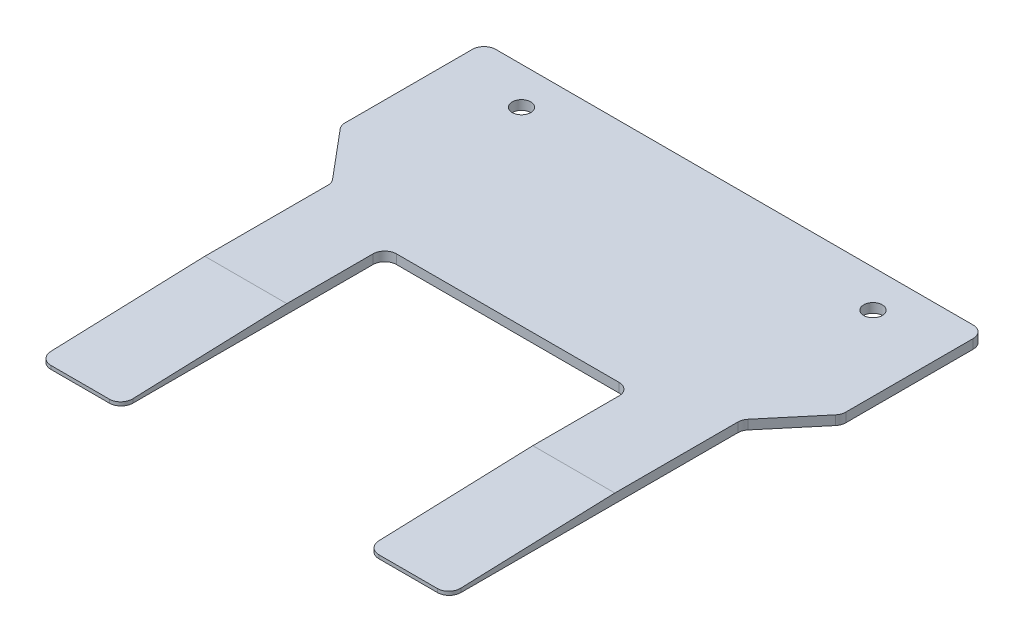
ISO-10303-21;
HEADER;
FILE_DESCRIPTION(('STEP AP214'),'2;1');
FILE_NAME('part.step','',(''),(''),'','','');
FILE_SCHEMA(('AUTOMOTIVE_DESIGN { 1 0 10303 214 1 1 1 1 }'));
ENDSEC;
DATA;
#1=APPLICATION_CONTEXT('core data for automotive mechanical design processes');
#2=APPLICATION_PROTOCOL_DEFINITION('international standard','automotive_design',2000,#1);
#3=PRODUCT_CONTEXT('',#1,'mechanical');
#4=PRODUCT('Part','Part','',(#3));
#5=PRODUCT_RELATED_PRODUCT_CATEGORY('part','',(#4));
#6=PRODUCT_DEFINITION_FORMATION('','',#4);
#7=PRODUCT_DEFINITION_CONTEXT('part definition',#1,'design');
#8=PRODUCT_DEFINITION('design','',#6,#7);
#9=PRODUCT_DEFINITION_SHAPE('','',#8);
#10=(LENGTH_UNIT() NAMED_UNIT(*) SI_UNIT(.MILLI.,.METRE.));
#11=(NAMED_UNIT(*) PLANE_ANGLE_UNIT() SI_UNIT($,.RADIAN.));
#12=(NAMED_UNIT(*) SI_UNIT($,.STERADIAN.) SOLID_ANGLE_UNIT());
#13=UNCERTAINTY_MEASURE_WITH_UNIT(LENGTH_MEASURE(1.E-05),#10,'distance_accuracy_value','');
#14=(GEOMETRIC_REPRESENTATION_CONTEXT(3) GLOBAL_UNCERTAINTY_ASSIGNED_CONTEXT((#13)) GLOBAL_UNIT_ASSIGNED_CONTEXT((#10,
#11,#12)) REPRESENTATION_CONTEXT('',''));
#15=CARTESIAN_POINT('',(0.,0.,0.));
#16=DIRECTION('',(0.,0.,1.));
#17=DIRECTION('',(1.,0.,0.));
#18=AXIS2_PLACEMENT_3D('',#15,#16,#17);
#19=CARTESIAN_POINT('',(-19.,1.5875,40.7));
#20=DIRECTION('',(0.,-1.,0.));
#21=DIRECTION('',(0.,0.,-1.));
#22=AXIS2_PLACEMENT_3D('',#19,#20,#21);
#23=PLANE('',#22);
#24=DIRECTION('',(0.,0.,1.));
#25=VECTOR('',#24,1.);
#26=CARTESIAN_POINT('',(-35.,1.5875,34.4279404685324));
#27=LINE('',#26,#25);
#28=CARTESIAN_POINT('',(-35.,1.5875,34.4279404685324));
#29=VERTEX_POINT('',#28);
#30=CARTESIAN_POINT('',(-35.,1.5875,55.4216998831214));
#31=VERTEX_POINT('',#30);
#32=EDGE_CURVE('E418',#29,#31,#27,.T.);
#33=ORIENTED_EDGE('',*,*,#32,.T.);
#34=DIRECTION('',(1.,0.,0.));
#35=VECTOR('',#34,1.);
#36=CARTESIAN_POINT('',(-42.75,1.5875,55.4216998831214));
#37=LINE('',#36,#35);
#38=CARTESIAN_POINT('',(-21.,1.5875,55.4216998831214));
#39=VERTEX_POINT('',#38);
#40=EDGE_CURVE('E424',#31,#39,#37,.T.);
#41=ORIENTED_EDGE('',*,*,#40,.T.);
#42=DIRECTION('',(0.,0.,-1.));
#43=VECTOR('',#42,1.);
#44=CARTESIAN_POINT('',(-21.,1.5875,81.7));
#45=LINE('',#44,#43);
#46=CARTESIAN_POINT('',(-21.,1.5875,40.7));
#47=VERTEX_POINT('',#46);
#48=EDGE_CURVE('E309',#39,#47,#45,.T.);
#49=ORIENTED_EDGE('',*,*,#48,.T.);
#50=CARTESIAN_POINT('',(-19.,1.5875,40.7));
#51=DIRECTION('',(0.,-1.,0.));
#52=DIRECTION('',(0.,0.,-1.));
#53=AXIS2_PLACEMENT_3D('',#50,#51,#52);
#54=CIRCLE('',#53,2.);
#55=CARTESIAN_POINT('',(-19.,1.5875,38.7));
#56=VERTEX_POINT('',#55);
#57=EDGE_CURVE('E360',#47,#56,#54,.T.);
#58=ORIENTED_EDGE('',*,*,#57,.T.);
#59=DIRECTION('',(1.,0.,0.));
#60=VECTOR('',#59,1.);
#61=CARTESIAN_POINT('',(-19.,1.5875,38.7));
#62=LINE('',#61,#60);
#63=CARTESIAN_POINT('',(19.,1.5875,38.7));
#64=VERTEX_POINT('',#63);
#65=EDGE_CURVE('E290',#56,#64,#62,.T.);
#66=ORIENTED_EDGE('',*,*,#65,.T.);
#67=CARTESIAN_POINT('',(19.,1.5875,40.7));
#68=DIRECTION('',(0.,-1.,0.));
#69=DIRECTION('',(0.,0.,-1.));
#70=AXIS2_PLACEMENT_3D('',#67,#68,#69);
#71=CIRCLE('',#70,2.);
#72=CARTESIAN_POINT('',(21.,1.5875,40.7));
#73=VERTEX_POINT('',#72);
#74=EDGE_CURVE('E390',#64,#73,#71,.T.);
#75=ORIENTED_EDGE('',*,*,#74,.T.);
#76=DIRECTION('',(0.,0.,1.));
#77=VECTOR('',#76,1.);
#78=CARTESIAN_POINT('',(21.,1.5875,40.7));
#79=LINE('',#78,#77);
#80=CARTESIAN_POINT('',(21.,1.5875,55.4216998831214));
#81=VERTEX_POINT('',#80);
#82=EDGE_CURVE('E392',#73,#81,#79,.T.);
#83=ORIENTED_EDGE('',*,*,#82,.T.);
#84=CARTESIAN_POINT('',(35.,1.5875,55.4216998831214));
#85=VERTEX_POINT('',#84);
#86=EDGE_CURVE('E220',#81,#85,#37,.T.);
#87=ORIENTED_EDGE('',*,*,#86,.T.);
#88=DIRECTION('',(0.,0.,-1.));
#89=VECTOR('',#88,1.);
#90=CARTESIAN_POINT('',(35.,1.5875,81.7));
#91=LINE('',#90,#89);
#92=CARTESIAN_POINT('',(35.,1.5875,34.4279404685324));
#93=VERTEX_POINT('',#92);
#94=EDGE_CURVE('E395',#85,#93,#91,.T.);
#95=ORIENTED_EDGE('',*,*,#94,.T.);
#96=CARTESIAN_POINT('',(37.,1.5875,34.4279404685324));
#97=DIRECTION('',(0.,-1.,0.));
#98=DIRECTION('',(0.,0.,1.));
#99=AXIS2_PLACEMENT_3D('',#96,#97,#98);
#100=CIRCLE('',#99,2.);
#101=CARTESIAN_POINT('',(35.4679111137621,1.5875,33.1423652491593));
#102=VERTEX_POINT('',#101);
#103=EDGE_CURVE('E397',#93,#102,#100,.T.);
#104=ORIENTED_EDGE('',*,*,#103,.T.);
#105=DIRECTION('',(0.64278760968654,0.,-0.766044443118977));
#106=VECTOR('',#105,1.);
#107=CARTESIAN_POINT('',(42.282088886238,1.5875,25.0215444082355));
#108=LINE('',#107,#106);
#109=CARTESIAN_POINT('',(42.282088886238,1.5875,25.0215444082355));
#110=VERTEX_POINT('',#109);
#111=EDGE_CURVE('E399',#102,#110,#108,.T.);
#112=ORIENTED_EDGE('',*,*,#111,.T.);
#113=CARTESIAN_POINT('',(40.75,1.5875,23.7359691888625));
#114=DIRECTION('',(0.,1.,0.));
#115=DIRECTION('',(0.,0.,-1.));
#116=AXIS2_PLACEMENT_3D('',#113,#114,#115);
#117=CIRCLE('',#116,2.);
#118=CARTESIAN_POINT('',(42.75,1.5875,23.7359691888625));
#119=VERTEX_POINT('',#118);
#120=EDGE_CURVE('E401',#110,#119,#117,.T.);
#121=ORIENTED_EDGE('',*,*,#120,.T.);
#122=DIRECTION('',(0.,0.,-1.));
#123=VECTOR('',#122,1.);
#124=CARTESIAN_POINT('',(42.75,1.5875,2.));
#125=LINE('',#124,#123);
#126=CARTESIAN_POINT('',(42.75,1.5875,2.));
#127=VERTEX_POINT('',#126);
#128=EDGE_CURVE('E403',#119,#127,#125,.T.);
#129=ORIENTED_EDGE('',*,*,#128,.T.);
#130=CARTESIAN_POINT('',(40.75,1.5875,2.));
#131=DIRECTION('',(0.,1.,0.));
#132=DIRECTION('',(0.,0.,-1.));
#133=AXIS2_PLACEMENT_3D('',#130,#131,#132);
#134=CIRCLE('',#133,2.);
#135=CARTESIAN_POINT('',(40.75,1.5875,0.));
#136=VERTEX_POINT('',#135);
#137=EDGE_CURVE('E405',#127,#136,#134,.T.);
#138=ORIENTED_EDGE('',*,*,#137,.T.);
#139=DIRECTION('',(-1.,0.,0.));
#140=VECTOR('',#139,1.);
#141=CARTESIAN_POINT('',(-40.75,1.5875,0.));
#142=LINE('',#141,#140);
#143=CARTESIAN_POINT('',(-40.75,1.5875,0.));
#144=VERTEX_POINT('',#143);
#145=EDGE_CURVE('E407',#136,#144,#142,.T.);
#146=ORIENTED_EDGE('',*,*,#145,.T.);
#147=CARTESIAN_POINT('',(-40.75,1.5875,2.));
#148=DIRECTION('',(0.,1.,0.));
#149=DIRECTION('',(0.,0.,-1.));
#150=AXIS2_PLACEMENT_3D('',#147,#148,#149);
#151=CIRCLE('',#150,2.);
#152=CARTESIAN_POINT('',(-42.75,1.5875,2.));
#153=VERTEX_POINT('',#152);
#154=EDGE_CURVE('E409',#144,#153,#151,.T.);
#155=ORIENTED_EDGE('',*,*,#154,.T.);
#156=DIRECTION('',(0.,0.,1.));
#157=VECTOR('',#156,1.);
#158=CARTESIAN_POINT('',(-42.75,1.5875,23.7359691888625));
#159=LINE('',#158,#157);
#160=CARTESIAN_POINT('',(-42.75,1.5875,23.7359691888625));
#161=VERTEX_POINT('',#160);
#162=EDGE_CURVE('E411',#153,#161,#159,.T.);
#163=ORIENTED_EDGE('',*,*,#162,.T.);
#164=CARTESIAN_POINT('',(-40.75,1.5875,23.7359691888625));
#165=DIRECTION('',(0.,1.,0.));
#166=DIRECTION('',(0.,0.,-1.));
#167=AXIS2_PLACEMENT_3D('',#164,#165,#166);
#168=CIRCLE('',#167,2.);
#169=CARTESIAN_POINT('',(-42.282088886238,1.5875,25.0215444082355));
#170=VERTEX_POINT('',#169);
#171=EDGE_CURVE('E413',#161,#170,#168,.T.);
#172=ORIENTED_EDGE('',*,*,#171,.T.);
#173=DIRECTION('',(0.64278760968654,0.,0.766044443118977));
#174=VECTOR('',#173,1.);
#175=CARTESIAN_POINT('',(-35.4679111137621,1.5875,33.1423652491593));
#176=LINE('',#175,#174);
#177=CARTESIAN_POINT('',(-35.4679111137621,1.5875,33.1423652491593));
#178=VERTEX_POINT('',#177);
#179=EDGE_CURVE('E415',#170,#178,#176,.T.);
#180=ORIENTED_EDGE('',*,*,#179,.T.);
#181=CARTESIAN_POINT('',(-37.,1.5875,34.4279404685324));
#182=DIRECTION('',(0.,-1.,0.));
#183=DIRECTION('',(0.,0.,-1.));
#184=AXIS2_PLACEMENT_3D('',#181,#182,#183);
#185=CIRCLE('',#184,2.);
#186=EDGE_CURVE('E417',#178,#29,#185,.T.);
#187=ORIENTED_EDGE('',*,*,#186,.T.);
#188=EDGE_LOOP('',(#33,#41,#49,#58,#66,#75,#83,#87,#95,#104,#112,#121,#129,#138,#146,#155,#163,
#172,#180,#187));
#189=FACE_BOUND('',#188,.T.);
#190=CARTESIAN_POINT('',(-30.,1.5875,6.35));
#191=DIRECTION('',(0.,1.,0.));
#192=DIRECTION('',(0.,0.,1.));
#193=AXIS2_PLACEMENT_3D('',#190,#191,#192);
#194=CIRCLE('',#193,1.5875);
#195=CARTESIAN_POINT('',(-30.,1.5875,7.9375));
#196=VERTEX_POINT('',#195);
#197=EDGE_CURVE('E301',#196,#196,#194,.T.);
#198=ORIENTED_EDGE('',*,*,#197,.F.);
#199=EDGE_LOOP('',(#198));
#200=FACE_BOUND('',#199,.T.);
#201=CARTESIAN_POINT('',(30.,1.5875,6.35));
#202=DIRECTION('',(0.,1.,0.));
#203=DIRECTION('',(0.,0.,1.));
#204=AXIS2_PLACEMENT_3D('',#201,#202,#203);
#205=CIRCLE('',#204,1.58750000000001);
#206=CARTESIAN_POINT('',(30.,1.5875,7.93750000000001));
#207=VERTEX_POINT('',#206);
#208=EDGE_CURVE('E377',#207,#207,#205,.T.);
#209=ORIENTED_EDGE('',*,*,#208,.F.);
#210=EDGE_LOOP('',(#209));
#211=FACE_BOUND('',#210,.T.);
#212=ADVANCED_FACE('F33',(#189,#200,#211),#23,.F.);
#213=CARTESIAN_POINT('',(-19.,0.,40.7));
#214=DIRECTION('',(0.,-1.,0.));
#215=DIRECTION('',(0.,0.,-1.));
#216=AXIS2_PLACEMENT_3D('',#213,#214,#215);
#217=PLANE('',#216);
#218=CARTESIAN_POINT('',(-30.,0.,6.35));
#219=DIRECTION('',(0.,1.,0.));
#220=DIRECTION('',(0.,0.,1.));
#221=AXIS2_PLACEMENT_3D('',#218,#219,#220);
#222=CIRCLE('',#221,1.5875);
#223=CARTESIAN_POINT('',(-30.,0.,7.9375));
#224=VERTEX_POINT('',#223);
#225=EDGE_CURVE('E306',#224,#224,#222,.T.);
#226=ORIENTED_EDGE('',*,*,#225,.T.);
#227=EDGE_LOOP('',(#226));
#228=FACE_BOUND('',#227,.T.);
#229=CARTESIAN_POINT('',(-19.,0.,40.7));
#230=DIRECTION('',(0.,-1.,0.));
#231=DIRECTION('',(0.,0.,-1.));
#232=AXIS2_PLACEMENT_3D('',#229,#230,#231);
#233=CIRCLE('',#232,2.);
#234=CARTESIAN_POINT('',(-21.,0.,40.7));
#235=VERTEX_POINT('',#234);
#236=CARTESIAN_POINT('',(-19.,0.,38.7));
#237=VERTEX_POINT('',#236);
#238=EDGE_CURVE('E296',#235,#237,#233,.T.);
#239=ORIENTED_EDGE('',*,*,#238,.F.);
#240=DIRECTION('',(0.,0.,-1.));
#241=VECTOR('',#240,1.);
#242=CARTESIAN_POINT('',(-21.,0.,81.7));
#243=LINE('',#242,#241);
#244=CARTESIAN_POINT('',(-21.,0.,81.7));
#245=VERTEX_POINT('',#244);
#246=EDGE_CURVE('E358',#245,#235,#243,.T.);
#247=ORIENTED_EDGE('',*,*,#246,.F.);
#248=CARTESIAN_POINT('',(-23.,0.,81.7));
#249=DIRECTION('',(0.,1.,0.));
#250=DIRECTION('',(0.,0.,-1.));
#251=AXIS2_PLACEMENT_3D('',#248,#249,#250);
#252=CIRCLE('',#251,2.);
#253=CARTESIAN_POINT('',(-23.,0.,83.7));
#254=VERTEX_POINT('',#253);
#255=EDGE_CURVE('E355',#254,#245,#252,.T.);
#256=ORIENTED_EDGE('',*,*,#255,.F.);
#257=DIRECTION('',(1.,0.,0.));
#258=VECTOR('',#257,1.);
#259=CARTESIAN_POINT('',(-33.,0.,83.7));
#260=LINE('',#259,#258);
#261=CARTESIAN_POINT('',(-33.,0.,83.7));
#262=VERTEX_POINT('',#261);
#263=EDGE_CURVE('E353',#262,#254,#260,.T.);
#264=ORIENTED_EDGE('',*,*,#263,.F.);
#265=CARTESIAN_POINT('',(-33.,0.,81.7));
#266=DIRECTION('',(0.,1.,0.));
#267=DIRECTION('',(0.,0.,1.));
#268=AXIS2_PLACEMENT_3D('',#265,#266,#267);
#269=CIRCLE('',#268,2.);
#270=CARTESIAN_POINT('',(-35.,0.,81.7));
#271=VERTEX_POINT('',#270);
#272=EDGE_CURVE('E225',#271,#262,#269,.T.);
#273=ORIENTED_EDGE('',*,*,#272,.F.);
#274=DIRECTION('',(0.,0.,1.));
#275=VECTOR('',#274,1.);
#276=CARTESIAN_POINT('',(-35.,0.,34.4279404685324));
#277=LINE('',#276,#275);
#278=CARTESIAN_POINT('',(-35.,0.,34.4279404685324));
#279=VERTEX_POINT('',#278);
#280=EDGE_CURVE('E349',#279,#271,#277,.T.);
#281=ORIENTED_EDGE('',*,*,#280,.F.);
#282=CARTESIAN_POINT('',(-37.,0.,34.4279404685324));
#283=DIRECTION('',(0.,-1.,0.));
#284=DIRECTION('',(0.,0.,-1.));
#285=AXIS2_PLACEMENT_3D('',#282,#283,#284);
#286=CIRCLE('',#285,2.);
#287=CARTESIAN_POINT('',(-35.4679111137621,0.,33.1423652491593));
#288=VERTEX_POINT('',#287);
#289=EDGE_CURVE('E347',#288,#279,#286,.T.);
#290=ORIENTED_EDGE('',*,*,#289,.F.);
#291=DIRECTION('',(0.64278760968654,0.,0.766044443118977));
#292=VECTOR('',#291,1.);
#293=CARTESIAN_POINT('',(-35.4679111137621,0.,33.1423652491593));
#294=LINE('',#293,#292);
#295=CARTESIAN_POINT('',(-42.282088886238,0.,25.0215444082355));
#296=VERTEX_POINT('',#295);
#297=EDGE_CURVE('E345',#296,#288,#294,.T.);
#298=ORIENTED_EDGE('',*,*,#297,.F.);
#299=CARTESIAN_POINT('',(-40.75,0.,23.7359691888625));
#300=DIRECTION('',(0.,1.,0.));
#301=DIRECTION('',(0.,0.,-1.));
#302=AXIS2_PLACEMENT_3D('',#299,#300,#301);
#303=CIRCLE('',#302,2.);
#304=CARTESIAN_POINT('',(-42.75,0.,23.7359691888625));
#305=VERTEX_POINT('',#304);
#306=EDGE_CURVE('E343',#305,#296,#303,.T.);
#307=ORIENTED_EDGE('',*,*,#306,.F.);
#308=DIRECTION('',(0.,0.,1.));
#309=VECTOR('',#308,1.);
#310=CARTESIAN_POINT('',(-42.75,0.,23.7359691888625));
#311=LINE('',#310,#309);
#312=CARTESIAN_POINT('',(-42.75,0.,2.));
#313=VERTEX_POINT('',#312);
#314=EDGE_CURVE('E341',#313,#305,#311,.T.);
#315=ORIENTED_EDGE('',*,*,#314,.F.);
#316=CARTESIAN_POINT('',(-40.75,0.,2.));
#317=DIRECTION('',(0.,1.,0.));
#318=DIRECTION('',(0.,0.,-1.));
#319=AXIS2_PLACEMENT_3D('',#316,#317,#318);
#320=CIRCLE('',#319,2.);
#321=CARTESIAN_POINT('',(-40.75,0.,0.));
#322=VERTEX_POINT('',#321);
#323=EDGE_CURVE('E339',#322,#313,#320,.T.);
#324=ORIENTED_EDGE('',*,*,#323,.F.);
#325=DIRECTION('',(-1.,0.,0.));
#326=VECTOR('',#325,1.);
#327=CARTESIAN_POINT('',(-40.75,0.,0.));
#328=LINE('',#327,#326);
#329=CARTESIAN_POINT('',(40.75,0.,0.));
#330=VERTEX_POINT('',#329);
#331=EDGE_CURVE('E337',#330,#322,#328,.T.);
#332=ORIENTED_EDGE('',*,*,#331,.F.);
#333=CARTESIAN_POINT('',(40.75,0.,2.));
#334=DIRECTION('',(0.,1.,0.));
#335=DIRECTION('',(0.,0.,-1.));
#336=AXIS2_PLACEMENT_3D('',#333,#334,#335);
#337=CIRCLE('',#336,2.);
#338=CARTESIAN_POINT('',(42.75,0.,2.));
#339=VERTEX_POINT('',#338);
#340=EDGE_CURVE('E335',#339,#330,#337,.T.);
#341=ORIENTED_EDGE('',*,*,#340,.F.);
#342=DIRECTION('',(0.,0.,-1.));
#343=VECTOR('',#342,1.);
#344=CARTESIAN_POINT('',(42.75,0.,2.));
#345=LINE('',#344,#343);
#346=CARTESIAN_POINT('',(42.75,0.,23.7359691888625));
#347=VERTEX_POINT('',#346);
#348=EDGE_CURVE('E333',#347,#339,#345,.T.);
#349=ORIENTED_EDGE('',*,*,#348,.F.);
#350=CARTESIAN_POINT('',(40.75,0.,23.7359691888625));
#351=DIRECTION('',(0.,1.,0.));
#352=DIRECTION('',(0.,0.,-1.));
#353=AXIS2_PLACEMENT_3D('',#350,#351,#352);
#354=CIRCLE('',#353,2.);
#355=CARTESIAN_POINT('',(42.282088886238,0.,25.0215444082355));
#356=VERTEX_POINT('',#355);
#357=EDGE_CURVE('E331',#356,#347,#354,.T.);
#358=ORIENTED_EDGE('',*,*,#357,.F.);
#359=DIRECTION('',(0.64278760968654,0.,-0.766044443118977));
#360=VECTOR('',#359,1.);
#361=CARTESIAN_POINT('',(42.282088886238,0.,25.0215444082355));
#362=LINE('',#361,#360);
#363=CARTESIAN_POINT('',(35.4679111137621,0.,33.1423652491593));
#364=VERTEX_POINT('',#363);
#365=EDGE_CURVE('E329',#364,#356,#362,.T.);
#366=ORIENTED_EDGE('',*,*,#365,.F.);
#367=CARTESIAN_POINT('',(37.,0.,34.4279404685324));
#368=DIRECTION('',(0.,-1.,0.));
#369=DIRECTION('',(0.,0.,1.));
#370=AXIS2_PLACEMENT_3D('',#367,#368,#369);
#371=CIRCLE('',#370,2.);
#372=CARTESIAN_POINT('',(35.,0.,34.4279404685324));
#373=VERTEX_POINT('',#372);
#374=EDGE_CURVE('E327',#373,#364,#371,.T.);
#375=ORIENTED_EDGE('',*,*,#374,.F.);
#376=DIRECTION('',(0.,0.,-1.));
#377=VECTOR('',#376,1.);
#378=CARTESIAN_POINT('',(35.,0.,81.7));
#379=LINE('',#378,#377);
#380=CARTESIAN_POINT('',(35.,0.,81.7));
#381=VERTEX_POINT('',#380);
#382=EDGE_CURVE('E325',#381,#373,#379,.T.);
#383=ORIENTED_EDGE('',*,*,#382,.F.);
#384=CARTESIAN_POINT('',(33.,0.,81.7));
#385=DIRECTION('',(0.,1.,0.));
#386=DIRECTION('',(0.,0.,1.));
#387=AXIS2_PLACEMENT_3D('',#384,#385,#386);
#388=CIRCLE('',#387,2.);
#389=CARTESIAN_POINT('',(33.,0.,83.7));
#390=VERTEX_POINT('',#389);
#391=EDGE_CURVE('E322',#390,#381,#388,.T.);
#392=ORIENTED_EDGE('',*,*,#391,.F.);
#393=DIRECTION('',(1.,0.,0.));
#394=VECTOR('',#393,1.);
#395=CARTESIAN_POINT('',(23.,0.,83.7));
#396=LINE('',#395,#394);
#397=CARTESIAN_POINT('',(23.,0.,83.7));
#398=VERTEX_POINT('',#397);
#399=EDGE_CURVE('E319',#398,#390,#396,.T.);
#400=ORIENTED_EDGE('',*,*,#399,.F.);
#401=CARTESIAN_POINT('',(23.,0.,81.7));
#402=DIRECTION('',(0.,1.,0.));
#403=DIRECTION('',(0.,0.,1.));
#404=AXIS2_PLACEMENT_3D('',#401,#402,#403);
#405=CIRCLE('',#404,2.);
#406=CARTESIAN_POINT('',(21.,0.,81.7));
#407=VERTEX_POINT('',#406);
#408=EDGE_CURVE('E316',#407,#398,#405,.T.);
#409=ORIENTED_EDGE('',*,*,#408,.F.);
#410=DIRECTION('',(0.,0.,1.));
#411=VECTOR('',#410,1.);
#412=CARTESIAN_POINT('',(21.,0.,40.7));
#413=LINE('',#412,#411);
#414=CARTESIAN_POINT('',(21.,0.,40.7));
#415=VERTEX_POINT('',#414);
#416=EDGE_CURVE('E313',#415,#407,#413,.T.);
#417=ORIENTED_EDGE('',*,*,#416,.F.);
#418=CARTESIAN_POINT('',(19.,0.,40.7));
#419=DIRECTION('',(0.,-1.,0.));
#420=DIRECTION('',(0.,0.,-1.));
#421=AXIS2_PLACEMENT_3D('',#418,#419,#420);
#422=CIRCLE('',#421,2.);
#423=CARTESIAN_POINT('',(19.,0.,38.7));
#424=VERTEX_POINT('',#423);
#425=EDGE_CURVE('E303',#424,#415,#422,.T.);
#426=ORIENTED_EDGE('',*,*,#425,.F.);
#427=DIRECTION('',(1.,0.,0.));
#428=VECTOR('',#427,1.);
#429=CARTESIAN_POINT('',(-19.,0.,38.7));
#430=LINE('',#429,#428);
#431=EDGE_CURVE('E289',#237,#424,#430,.T.);
#432=ORIENTED_EDGE('',*,*,#431,.F.);
#433=EDGE_LOOP('',(#239,#247,#256,#264,#273,#281,#290,#298,#307,#315,#324,#332,#341,#349,#358,
#366,#375,#383,#392,#400,#409,#417,#426,#432));
#434=FACE_BOUND('',#433,.T.);
#435=CARTESIAN_POINT('',(30.,0.,6.35));
#436=DIRECTION('',(0.,1.,0.));
#437=DIRECTION('',(0.,0.,1.));
#438=AXIS2_PLACEMENT_3D('',#435,#436,#437);
#439=CIRCLE('',#438,1.58750000000001);
#440=CARTESIAN_POINT('',(30.,0.,7.93750000000001));
#441=VERTEX_POINT('',#440);
#442=EDGE_CURVE('E375',#441,#441,#439,.T.);
#443=ORIENTED_EDGE('',*,*,#442,.T.);
#444=EDGE_LOOP('',(#443));
#445=FACE_BOUND('',#444,.T.);
#446=ADVANCED_FACE('F368',(#228,#434,#445),#217,.T.);
#447=CARTESIAN_POINT('',(-19.,1.5875,40.7));
#448=DIRECTION('',(0.,-1.,0.));
#449=DIRECTION('',(0.,0.,-1.));
#450=AXIS2_PLACEMENT_3D('',#447,#448,#449);
#451=CYLINDRICAL_SURFACE('',#450,2.);
#452=ORIENTED_EDGE('',*,*,#238,.T.);
#453=DIRECTION('',(0.,-1.,0.));
#454=VECTOR('',#453,1.);
#455=CARTESIAN_POINT('',(-19.,1.5875,38.7));
#456=LINE('',#455,#454);
#457=EDGE_CURVE('E41',#56,#237,#456,.T.);
#458=ORIENTED_EDGE('',*,*,#457,.F.);
#459=ORIENTED_EDGE('',*,*,#57,.F.);
#460=DIRECTION('',(0.,-1.,0.));
#461=VECTOR('',#460,1.);
#462=CARTESIAN_POINT('',(-21.,1.5875,40.7));
#463=LINE('',#462,#461);
#464=EDGE_CURVE('E298',#47,#235,#463,.T.);
#465=ORIENTED_EDGE('',*,*,#464,.T.);
#466=EDGE_LOOP('',(#452,#458,#459,#465));
#467=FACE_BOUND('',#466,.T.);
#468=ADVANCED_FACE('F35',(#467),#451,.F.);
#469=CARTESIAN_POINT('',(-19.,1.5875,38.7));
#470=DIRECTION('',(0.,0.,-1.));
#471=DIRECTION('',(-1.,0.,0.));
#472=AXIS2_PLACEMENT_3D('',#469,#470,#471);
#473=PLANE('',#472);
#474=ORIENTED_EDGE('',*,*,#431,.T.);
#475=DIRECTION('',(0.,-1.,0.));
#476=VECTOR('',#475,1.);
#477=CARTESIAN_POINT('',(19.,1.5875,38.7));
#478=LINE('',#477,#476);
#479=EDGE_CURVE('E281',#64,#424,#478,.T.);
#480=ORIENTED_EDGE('',*,*,#479,.F.);
#481=ORIENTED_EDGE('',*,*,#65,.F.);
#482=ORIENTED_EDGE('',*,*,#457,.T.);
#483=EDGE_LOOP('',(#474,#480,#481,#482));
#484=FACE_BOUND('',#483,.T.);
#485=ADVANCED_FACE('F287',(#484),#473,.F.);
#486=CARTESIAN_POINT('',(19.,1.5875,40.7));
#487=DIRECTION('',(0.,-1.,0.));
#488=DIRECTION('',(0.,0.,-1.));
#489=AXIS2_PLACEMENT_3D('',#486,#487,#488);
#490=CYLINDRICAL_SURFACE('',#489,2.);
#491=ORIENTED_EDGE('',*,*,#425,.T.);
#492=DIRECTION('',(0.,-1.,0.));
#493=VECTOR('',#492,1.);
#494=CARTESIAN_POINT('',(21.,1.5875,40.7));
#495=LINE('',#494,#493);
#496=EDGE_CURVE('E278',#73,#415,#495,.T.);
#497=ORIENTED_EDGE('',*,*,#496,.F.);
#498=ORIENTED_EDGE('',*,*,#74,.F.);
#499=ORIENTED_EDGE('',*,*,#479,.T.);
#500=EDGE_LOOP('',(#491,#497,#498,#499));
#501=FACE_BOUND('',#500,.T.);
#502=ADVANCED_FACE('F462',(#501),#490,.F.);
#503=CARTESIAN_POINT('',(21.,1.5875,40.7));
#504=DIRECTION('',(1.,0.,0.));
#505=DIRECTION('',(0.,0.,-1.));
#506=AXIS2_PLACEMENT_3D('',#503,#504,#505);
#507=PLANE('',#506);
#508=DIRECTION('',(0.,-1.,0.));
#509=VECTOR('',#508,1.);
#510=CARTESIAN_POINT('',(21.,1.5875,81.7));
#511=LINE('',#510,#509);
#512=CARTESIAN_POINT('',(21.,0.669841538983497,81.7));
#513=VERTEX_POINT('',#512);
#514=EDGE_CURVE('E276',#513,#407,#511,.T.);
#515=ORIENTED_EDGE('',*,*,#514,.F.);
#516=DIRECTION('',(0.,0.0348994967025017,-0.999390827019096));
#517=VECTOR('',#516,1.);
#518=CARTESIAN_POINT('',(21.,2.10096693568294,40.7179306605026));
#519=LINE('',#518,#517);
#520=EDGE_CURVE('E378',#513,#81,#519,.T.);
#521=ORIENTED_EDGE('',*,*,#520,.T.);
#522=ORIENTED_EDGE('',*,*,#82,.F.);
#523=ORIENTED_EDGE('',*,*,#496,.T.);
#524=ORIENTED_EDGE('',*,*,#416,.T.);
#525=EDGE_LOOP('',(#515,#521,#522,#523,#524));
#526=FACE_BOUND('',#525,.T.);
#527=ADVANCED_FACE('F440',(#526),#507,.F.);
#528=CARTESIAN_POINT('',(23.,1.5875,81.7));
#529=DIRECTION('',(0.,-1.,0.));
#530=DIRECTION('',(0.,0.,-1.));
#531=AXIS2_PLACEMENT_3D('',#528,#529,#530);
#532=CYLINDRICAL_SURFACE('',#531,2.);
#533=DIRECTION('',(0.,-1.,0.));
#534=VECTOR('',#533,1.);
#535=CARTESIAN_POINT('',(23.,1.5875,83.7));
#536=LINE('',#535,#534);
#537=CARTESIAN_POINT('',(23.,0.6,83.7));
#538=VERTEX_POINT('',#537);
#539=EDGE_CURVE('E274',#538,#398,#536,.T.);
#540=ORIENTED_EDGE('',*,*,#539,.F.);
#541=CARTESIAN_POINT('',(23.,0.669841538983497,81.7));
#542=DIRECTION('',(0.,-0.999390827019096,-0.0348994967025017));
#543=DIRECTION('',(0.,-0.0348994967025017,0.999390827019096));
#544=AXIS2_PLACEMENT_3D('',#541,#542,#543);
#545=ELLIPSE('',#544,2.00121908859764,2.);
#546=EDGE_CURVE('E383',#538,#513,#545,.T.);
#547=ORIENTED_EDGE('',*,*,#546,.T.);
#548=ORIENTED_EDGE('',*,*,#514,.T.);
#549=ORIENTED_EDGE('',*,*,#408,.T.);
#550=EDGE_LOOP('',(#540,#547,#548,#549));
#551=FACE_BOUND('',#550,.T.);
#552=ADVANCED_FACE('F437',(#551),#532,.T.);
#553=CARTESIAN_POINT('',(23.,1.5875,83.7));
#554=DIRECTION('',(0.,0.,-1.));
#555=DIRECTION('',(-1.,0.,0.));
#556=AXIS2_PLACEMENT_3D('',#553,#554,#555);
#557=PLANE('',#556);
#558=DIRECTION('',(0.,-1.,0.));
#559=VECTOR('',#558,1.);
#560=CARTESIAN_POINT('',(33.,1.5875,83.7));
#561=LINE('',#560,#559);
#562=CARTESIAN_POINT('',(33.,0.6,83.7));
#563=VERTEX_POINT('',#562);
#564=EDGE_CURVE('E272',#563,#390,#561,.T.);
#565=ORIENTED_EDGE('',*,*,#564,.F.);
#566=DIRECTION('',(1.,0.,0.));
#567=VECTOR('',#566,1.);
#568=CARTESIAN_POINT('',(-42.75,0.6,83.7));
#569=LINE('',#568,#567);
#570=EDGE_CURVE('E221',#538,#563,#569,.T.);
#571=ORIENTED_EDGE('',*,*,#570,.F.);
#572=ORIENTED_EDGE('',*,*,#539,.T.);
#573=ORIENTED_EDGE('',*,*,#399,.T.);
#574=EDGE_LOOP('',(#565,#571,#572,#573));
#575=FACE_BOUND('',#574,.T.);
#576=ADVANCED_FACE('F451',(#575),#557,.F.);
#577=CARTESIAN_POINT('',(33.,1.5875,81.7));
#578=DIRECTION('',(0.,-1.,0.));
#579=DIRECTION('',(0.,0.,-1.));
#580=AXIS2_PLACEMENT_3D('',#577,#578,#579);
#581=CYLINDRICAL_SURFACE('',#580,2.);
#582=DIRECTION('',(0.,-1.,0.));
#583=VECTOR('',#582,1.);
#584=CARTESIAN_POINT('',(35.,1.5875,81.7));
#585=LINE('',#584,#583);
#586=CARTESIAN_POINT('',(35.,0.669841538983497,81.7));
#587=VERTEX_POINT('',#586);
#588=EDGE_CURVE('E270',#587,#381,#585,.T.);
#589=ORIENTED_EDGE('',*,*,#588,.F.);
#590=CARTESIAN_POINT('',(33.,0.669841538983497,81.7));
#591=DIRECTION('',(0.,-0.999390827019096,-0.0348994967025017));
#592=DIRECTION('',(0.,-0.0348994967025017,0.999390827019096));
#593=AXIS2_PLACEMENT_3D('',#590,#591,#592);
#594=ELLIPSE('',#593,2.00121908859765,2.);
#595=EDGE_CURVE('E48',#587,#563,#594,.T.);
#596=ORIENTED_EDGE('',*,*,#595,.T.);
#597=ORIENTED_EDGE('',*,*,#564,.T.);
#598=ORIENTED_EDGE('',*,*,#391,.T.);
#599=EDGE_LOOP('',(#589,#596,#597,#598));
#600=FACE_BOUND('',#599,.T.);
#601=ADVANCED_FACE('F455',(#600),#581,.T.);
#602=CARTESIAN_POINT('',(35.,1.5875,81.7));
#603=DIRECTION('',(-1.,0.,0.));
#604=DIRECTION('',(0.,0.,1.));
#605=AXIS2_PLACEMENT_3D('',#602,#603,#604);
#606=PLANE('',#605);
#607=ORIENTED_EDGE('',*,*,#94,.F.);
#608=DIRECTION('',(0.,-0.0348994967025017,0.999390827019096));
#609=VECTOR('',#608,1.);
#610=CARTESIAN_POINT('',(35.,0.670959223928339,81.667993690829));
#611=LINE('',#610,#609);
#612=EDGE_CURVE('E430',#85,#587,#611,.T.);
#613=ORIENTED_EDGE('',*,*,#612,.T.);
#614=ORIENTED_EDGE('',*,*,#588,.T.);
#615=ORIENTED_EDGE('',*,*,#382,.T.);
#616=DIRECTION('',(0.,-1.,0.));
#617=VECTOR('',#616,1.);
#618=CARTESIAN_POINT('',(35.,1.5875,34.4279404685324));
#619=LINE('',#618,#617);
#620=EDGE_CURVE('E267',#93,#373,#619,.T.);
#621=ORIENTED_EDGE('',*,*,#620,.F.);
#622=EDGE_LOOP('',(#607,#613,#614,#615,#621));
#623=FACE_BOUND('',#622,.T.);
#624=ADVANCED_FACE('F458',(#623),#606,.F.);
#625=CARTESIAN_POINT('',(37.,1.5875,34.4279404685324));
#626=DIRECTION('',(0.,-1.,0.));
#627=DIRECTION('',(0.,0.,-1.));
#628=AXIS2_PLACEMENT_3D('',#625,#626,#627);
#629=CYLINDRICAL_SURFACE('',#628,2.);
#630=ORIENTED_EDGE('',*,*,#374,.T.);
#631=DIRECTION('',(0.,-1.,0.));
#632=VECTOR('',#631,1.);
#633=CARTESIAN_POINT('',(35.4679111137621,1.5875,33.1423652491593));
#634=LINE('',#633,#632);
#635=EDGE_CURVE('E264',#102,#364,#634,.T.);
#636=ORIENTED_EDGE('',*,*,#635,.F.);
#637=ORIENTED_EDGE('',*,*,#103,.F.);
#638=ORIENTED_EDGE('',*,*,#620,.T.);
#639=EDGE_LOOP('',(#630,#636,#637,#638));
#640=FACE_BOUND('',#639,.T.);
#641=ADVANCED_FACE('F529',(#640),#629,.F.);
#642=CARTESIAN_POINT('',(42.282088886238,1.5875,25.0215444082355));
#643=DIRECTION('',(-0.766044443118977,0.,-0.642787609686541));
#644=DIRECTION('',(-0.64278760968654,0.,0.766044443118977));
#645=AXIS2_PLACEMENT_3D('',#642,#643,#644);
#646=PLANE('',#645);
#647=ORIENTED_EDGE('',*,*,#365,.T.);
#648=DIRECTION('',(0.,-1.,0.));
#649=VECTOR('',#648,1.);
#650=CARTESIAN_POINT('',(42.282088886238,1.5875,25.0215444082355));
#651=LINE('',#650,#649);
#652=EDGE_CURVE('E261',#110,#356,#651,.T.);
#653=ORIENTED_EDGE('',*,*,#652,.F.);
#654=ORIENTED_EDGE('',*,*,#111,.F.);
#655=ORIENTED_EDGE('',*,*,#635,.T.);
#656=EDGE_LOOP('',(#647,#653,#654,#655));
#657=FACE_BOUND('',#656,.T.);
#658=ADVANCED_FACE('F525',(#657),#646,.F.);
#659=CARTESIAN_POINT('',(40.75,1.5875,23.7359691888625));
#660=DIRECTION('',(0.,-1.,0.));
#661=DIRECTION('',(0.,0.,-1.));
#662=AXIS2_PLACEMENT_3D('',#659,#660,#661);
#663=CYLINDRICAL_SURFACE('',#662,2.);
#664=ORIENTED_EDGE('',*,*,#357,.T.);
#665=DIRECTION('',(0.,-1.,0.));
#666=VECTOR('',#665,1.);
#667=CARTESIAN_POINT('',(42.75,1.5875,23.7359691888625));
#668=LINE('',#667,#666);
#669=EDGE_CURVE('E258',#119,#347,#668,.T.);
#670=ORIENTED_EDGE('',*,*,#669,.F.);
#671=ORIENTED_EDGE('',*,*,#120,.F.);
#672=ORIENTED_EDGE('',*,*,#652,.T.);
#673=EDGE_LOOP('',(#664,#670,#671,#672));
#674=FACE_BOUND('',#673,.T.);
#675=ADVANCED_FACE('F521',(#674),#663,.T.);
#676=CARTESIAN_POINT('',(42.75,1.5875,2.));
#677=DIRECTION('',(-1.,0.,0.));
#678=DIRECTION('',(0.,0.,1.));
#679=AXIS2_PLACEMENT_3D('',#676,#677,#678);
#680=PLANE('',#679);
#681=ORIENTED_EDGE('',*,*,#348,.T.);
#682=DIRECTION('',(0.,-1.,0.));
#683=VECTOR('',#682,1.);
#684=CARTESIAN_POINT('',(42.75,1.5875,2.));
#685=LINE('',#684,#683);
#686=EDGE_CURVE('E255',#127,#339,#685,.T.);
#687=ORIENTED_EDGE('',*,*,#686,.F.);
#688=ORIENTED_EDGE('',*,*,#128,.F.);
#689=ORIENTED_EDGE('',*,*,#669,.T.);
#690=EDGE_LOOP('',(#681,#687,#688,#689));
#691=FACE_BOUND('',#690,.T.);
#692=ADVANCED_FACE('F517',(#691),#680,.F.);
#693=CARTESIAN_POINT('',(40.75,1.5875,2.));
#694=DIRECTION('',(0.,-1.,0.));
#695=DIRECTION('',(0.,0.,-1.));
#696=AXIS2_PLACEMENT_3D('',#693,#694,#695);
#697=CYLINDRICAL_SURFACE('',#696,2.);
#698=ORIENTED_EDGE('',*,*,#340,.T.);
#699=DIRECTION('',(0.,-1.,0.));
#700=VECTOR('',#699,1.);
#701=CARTESIAN_POINT('',(40.75,1.5875,0.));
#702=LINE('',#701,#700);
#703=EDGE_CURVE('E252',#136,#330,#702,.T.);
#704=ORIENTED_EDGE('',*,*,#703,.F.);
#705=ORIENTED_EDGE('',*,*,#137,.F.);
#706=ORIENTED_EDGE('',*,*,#686,.T.);
#707=EDGE_LOOP('',(#698,#704,#705,#706));
#708=FACE_BOUND('',#707,.T.);
#709=ADVANCED_FACE('F513',(#708),#697,.T.);
#710=CARTESIAN_POINT('',(-40.75,1.5875,0.));
#711=DIRECTION('',(0.,0.,1.));
#712=DIRECTION('',(1.,0.,0.));
#713=AXIS2_PLACEMENT_3D('',#710,#711,#712);
#714=PLANE('',#713);
#715=ORIENTED_EDGE('',*,*,#331,.T.);
#716=DIRECTION('',(0.,-1.,0.));
#717=VECTOR('',#716,1.);
#718=CARTESIAN_POINT('',(-40.75,1.5875,0.));
#719=LINE('',#718,#717);
#720=EDGE_CURVE('E249',#144,#322,#719,.T.);
#721=ORIENTED_EDGE('',*,*,#720,.F.);
#722=ORIENTED_EDGE('',*,*,#145,.F.);
#723=ORIENTED_EDGE('',*,*,#703,.T.);
#724=EDGE_LOOP('',(#715,#721,#722,#723));
#725=FACE_BOUND('',#724,.T.);
#726=ADVANCED_FACE('F509',(#725),#714,.F.);
#727=CARTESIAN_POINT('',(-40.75,1.5875,2.));
#728=DIRECTION('',(0.,-1.,0.));
#729=DIRECTION('',(0.,0.,-1.));
#730=AXIS2_PLACEMENT_3D('',#727,#728,#729);
#731=CYLINDRICAL_SURFACE('',#730,2.);
#732=ORIENTED_EDGE('',*,*,#323,.T.);
#733=DIRECTION('',(0.,-1.,0.));
#734=VECTOR('',#733,1.);
#735=CARTESIAN_POINT('',(-42.75,1.5875,2.));
#736=LINE('',#735,#734);
#737=EDGE_CURVE('E246',#153,#313,#736,.T.);
#738=ORIENTED_EDGE('',*,*,#737,.F.);
#739=ORIENTED_EDGE('',*,*,#154,.F.);
#740=ORIENTED_EDGE('',*,*,#720,.T.);
#741=EDGE_LOOP('',(#732,#738,#739,#740));
#742=FACE_BOUND('',#741,.T.);
#743=ADVANCED_FACE('F505',(#742),#731,.T.);
#744=CARTESIAN_POINT('',(-42.75,1.5875,23.7359691888625));
#745=DIRECTION('',(1.,0.,0.));
#746=DIRECTION('',(0.,0.,-1.));
#747=AXIS2_PLACEMENT_3D('',#744,#745,#746);
#748=PLANE('',#747);
#749=ORIENTED_EDGE('',*,*,#314,.T.);
#750=DIRECTION('',(0.,-1.,0.));
#751=VECTOR('',#750,1.);
#752=CARTESIAN_POINT('',(-42.75,1.5875,23.7359691888625));
#753=LINE('',#752,#751);
#754=EDGE_CURVE('E243',#161,#305,#753,.T.);
#755=ORIENTED_EDGE('',*,*,#754,.F.);
#756=ORIENTED_EDGE('',*,*,#162,.F.);
#757=ORIENTED_EDGE('',*,*,#737,.T.);
#758=EDGE_LOOP('',(#749,#755,#756,#757));
#759=FACE_BOUND('',#758,.T.);
#760=ADVANCED_FACE('F501',(#759),#748,.F.);
#761=CARTESIAN_POINT('',(-40.75,1.5875,23.7359691888625));
#762=DIRECTION('',(0.,-1.,0.));
#763=DIRECTION('',(0.,0.,-1.));
#764=AXIS2_PLACEMENT_3D('',#761,#762,#763);
#765=CYLINDRICAL_SURFACE('',#764,2.);
#766=ORIENTED_EDGE('',*,*,#306,.T.);
#767=DIRECTION('',(0.,-1.,0.));
#768=VECTOR('',#767,1.);
#769=CARTESIAN_POINT('',(-42.282088886238,1.5875,25.0215444082355));
#770=LINE('',#769,#768);
#771=EDGE_CURVE('E240',#170,#296,#770,.T.);
#772=ORIENTED_EDGE('',*,*,#771,.F.);
#773=ORIENTED_EDGE('',*,*,#171,.F.);
#774=ORIENTED_EDGE('',*,*,#754,.T.);
#775=EDGE_LOOP('',(#766,#772,#773,#774));
#776=FACE_BOUND('',#775,.T.);
#777=ADVANCED_FACE('F497',(#776),#765,.T.);
#778=CARTESIAN_POINT('',(-35.4679111137621,1.5875,33.1423652491593));
#779=DIRECTION('',(0.766044443118977,0.,-0.64278760968654));
#780=DIRECTION('',(-0.64278760968654,0.,-0.766044443118977));
#781=AXIS2_PLACEMENT_3D('',#778,#779,#780);
#782=PLANE('',#781);
#783=ORIENTED_EDGE('',*,*,#297,.T.);
#784=DIRECTION('',(0.,-1.,0.));
#785=VECTOR('',#784,1.);
#786=CARTESIAN_POINT('',(-35.4679111137621,1.5875,33.1423652491593));
#787=LINE('',#786,#785);
#788=EDGE_CURVE('E237',#178,#288,#787,.T.);
#789=ORIENTED_EDGE('',*,*,#788,.F.);
#790=ORIENTED_EDGE('',*,*,#179,.F.);
#791=ORIENTED_EDGE('',*,*,#771,.T.);
#792=EDGE_LOOP('',(#783,#789,#790,#791));
#793=FACE_BOUND('',#792,.T.);
#794=ADVANCED_FACE('F493',(#793),#782,.F.);
#795=CARTESIAN_POINT('',(-37.,1.5875,34.4279404685324));
#796=DIRECTION('',(0.,-1.,0.));
#797=DIRECTION('',(0.,0.,-1.));
#798=AXIS2_PLACEMENT_3D('',#795,#796,#797);
#799=CYLINDRICAL_SURFACE('',#798,2.);
#800=ORIENTED_EDGE('',*,*,#289,.T.);
#801=DIRECTION('',(0.,-1.,0.));
#802=VECTOR('',#801,1.);
#803=CARTESIAN_POINT('',(-35.,1.5875,34.4279404685324));
#804=LINE('',#803,#802);
#805=EDGE_CURVE('E229',#29,#279,#804,.T.);
#806=ORIENTED_EDGE('',*,*,#805,.F.);
#807=ORIENTED_EDGE('',*,*,#186,.F.);
#808=ORIENTED_EDGE('',*,*,#788,.T.);
#809=EDGE_LOOP('',(#800,#806,#807,#808));
#810=FACE_BOUND('',#809,.T.);
#811=ADVANCED_FACE('F489',(#810),#799,.F.);
#812=CARTESIAN_POINT('',(-35.,1.5875,34.4279404685324));
#813=DIRECTION('',(1.,0.,0.));
#814=DIRECTION('',(0.,0.,-1.));
#815=AXIS2_PLACEMENT_3D('',#812,#813,#814);
#816=PLANE('',#815);
#817=DIRECTION('',(0.,-1.,0.));
#818=VECTOR('',#817,1.);
#819=CARTESIAN_POINT('',(-35.,1.5875,81.7));
#820=LINE('',#819,#818);
#821=CARTESIAN_POINT('',(-35.,0.669841538983497,81.7));
#822=VERTEX_POINT('',#821);
#823=EDGE_CURVE('E227',#822,#271,#820,.T.);
#824=ORIENTED_EDGE('',*,*,#823,.F.);
#825=DIRECTION('',(0.,0.0348994967025017,-0.999390827019096));
#826=VECTOR('',#825,1.);
#827=CARTESIAN_POINT('',(-35.,2.31972531369715,34.453510339928));
#828=LINE('',#827,#826);
#829=EDGE_CURVE('E208',#822,#31,#828,.T.);
#830=ORIENTED_EDGE('',*,*,#829,.T.);
#831=ORIENTED_EDGE('',*,*,#32,.F.);
#832=ORIENTED_EDGE('',*,*,#805,.T.);
#833=ORIENTED_EDGE('',*,*,#280,.T.);
#834=EDGE_LOOP('',(#824,#830,#831,#832,#833));
#835=FACE_BOUND('',#834,.T.);
#836=ADVANCED_FACE('F486',(#835),#816,.F.);
#837=CARTESIAN_POINT('',(-33.,1.5875,81.7));
#838=DIRECTION('',(0.,-1.,0.));
#839=DIRECTION('',(0.,0.,-1.));
#840=AXIS2_PLACEMENT_3D('',#837,#838,#839);
#841=CYLINDRICAL_SURFACE('',#840,2.);
#842=DIRECTION('',(0.,-1.,0.));
#843=VECTOR('',#842,1.);
#844=CARTESIAN_POINT('',(-33.,1.5875,83.7));
#845=LINE('',#844,#843);
#846=CARTESIAN_POINT('',(-33.,0.6,83.7));
#847=VERTEX_POINT('',#846);
#848=EDGE_CURVE('E217',#847,#262,#845,.T.);
#849=ORIENTED_EDGE('',*,*,#848,.F.);
#850=CARTESIAN_POINT('',(-33.,0.669841538983497,81.7));
#851=DIRECTION('',(0.,-0.999390827019096,-0.0348994967025017));
#852=DIRECTION('',(0.,-0.0348994967025017,0.999390827019096));
#853=AXIS2_PLACEMENT_3D('',#850,#851,#852);
#854=ELLIPSE('',#853,2.00121908859765,2.);
#855=EDGE_CURVE('E203',#847,#822,#854,.T.);
#856=ORIENTED_EDGE('',*,*,#855,.T.);
#857=ORIENTED_EDGE('',*,*,#823,.T.);
#858=ORIENTED_EDGE('',*,*,#272,.T.);
#859=EDGE_LOOP('',(#849,#856,#857,#858));
#860=FACE_BOUND('',#859,.T.);
#861=ADVANCED_FACE('F223',(#860),#841,.T.);
#862=CARTESIAN_POINT('',(-33.,1.5875,83.7));
#863=DIRECTION('',(0.,0.,-1.));
#864=DIRECTION('',(-1.,0.,0.));
#865=AXIS2_PLACEMENT_3D('',#862,#863,#864);
#866=PLANE('',#865);
#867=DIRECTION('',(0.,-1.,0.));
#868=VECTOR('',#867,1.);
#869=CARTESIAN_POINT('',(-23.,1.5875,83.7));
#870=LINE('',#869,#868);
#871=CARTESIAN_POINT('',(-23.,0.6,83.7));
#872=VERTEX_POINT('',#871);
#873=EDGE_CURVE('E219',#872,#254,#870,.T.);
#874=ORIENTED_EDGE('',*,*,#873,.F.);
#875=EDGE_CURVE('E206',#847,#872,#569,.T.);
#876=ORIENTED_EDGE('',*,*,#875,.F.);
#877=ORIENTED_EDGE('',*,*,#848,.T.);
#878=ORIENTED_EDGE('',*,*,#263,.T.);
#879=EDGE_LOOP('',(#874,#876,#877,#878));
#880=FACE_BOUND('',#879,.T.);
#881=ADVANCED_FACE('F215',(#880),#866,.F.);
#882=CARTESIAN_POINT('',(-23.,1.5875,81.7));
#883=DIRECTION('',(0.,-1.,0.));
#884=DIRECTION('',(0.,0.,-1.));
#885=AXIS2_PLACEMENT_3D('',#882,#883,#884);
#886=CYLINDRICAL_SURFACE('',#885,2.);
#887=DIRECTION('',(0.,-1.,0.));
#888=VECTOR('',#887,1.);
#889=CARTESIAN_POINT('',(-21.,1.5875,81.7));
#890=LINE('',#889,#888);
#891=CARTESIAN_POINT('',(-21.,0.669841538983498,81.7));
#892=VERTEX_POINT('',#891);
#893=EDGE_CURVE('E231',#892,#245,#890,.T.);
#894=ORIENTED_EDGE('',*,*,#893,.F.);
#895=CARTESIAN_POINT('',(-23.,0.669841538983497,81.7));
#896=DIRECTION('',(0.,-0.999390827019096,-0.0348994967025017));
#897=DIRECTION('',(0.,-0.0348994967025017,0.999390827019096));
#898=AXIS2_PLACEMENT_3D('',#895,#896,#897);
#899=ELLIPSE('',#898,2.00121908859765,2.);
#900=EDGE_CURVE('E56',#892,#872,#899,.T.);
#901=ORIENTED_EDGE('',*,*,#900,.T.);
#902=ORIENTED_EDGE('',*,*,#873,.T.);
#903=ORIENTED_EDGE('',*,*,#255,.T.);
#904=EDGE_LOOP('',(#894,#901,#902,#903));
#905=FACE_BOUND('',#904,.T.);
#906=ADVANCED_FACE('F367',(#905),#886,.T.);
#907=CARTESIAN_POINT('',(-21.,1.5875,81.7));
#908=DIRECTION('',(-1.,0.,0.));
#909=DIRECTION('',(0.,0.,1.));
#910=AXIS2_PLACEMENT_3D('',#907,#908,#909);
#911=PLANE('',#910);
#912=ORIENTED_EDGE('',*,*,#48,.F.);
#913=DIRECTION('',(0.,-0.0348994967025017,0.999390827019096));
#914=VECTOR('',#913,1.);
#915=CARTESIAN_POINT('',(-21.,0.670959223928339,81.667993690829));
#916=LINE('',#915,#914);
#917=EDGE_CURVE('E11',#39,#892,#916,.T.);
#918=ORIENTED_EDGE('',*,*,#917,.T.);
#919=ORIENTED_EDGE('',*,*,#893,.T.);
#920=ORIENTED_EDGE('',*,*,#246,.T.);
#921=ORIENTED_EDGE('',*,*,#464,.F.);
#922=EDGE_LOOP('',(#912,#918,#919,#920,#921));
#923=FACE_BOUND('',#922,.T.);
#924=ADVANCED_FACE('F364',(#923),#911,.F.);
#925=CARTESIAN_POINT('',(-30.,1.5875,6.35));
#926=DIRECTION('',(0.,-1.,0.));
#927=DIRECTION('',(0.,0.,-1.));
#928=AXIS2_PLACEMENT_3D('',#925,#926,#927);
#929=CYLINDRICAL_SURFACE('',#928,1.5875);
#930=ORIENTED_EDGE('',*,*,#197,.T.);
#931=EDGE_LOOP('',(#930));
#932=FACE_BOUND('',#931,.T.);
#933=ORIENTED_EDGE('',*,*,#225,.F.);
#934=EDGE_LOOP('',(#933));
#935=FACE_BOUND('',#934,.T.);
#936=ADVANCED_FACE('F475',(#932,#935),#929,.F.);
#937=CARTESIAN_POINT('',(30.,1.5875,6.35));
#938=DIRECTION('',(0.,-1.,0.));
#939=DIRECTION('',(0.,0.,-1.));
#940=AXIS2_PLACEMENT_3D('',#937,#938,#939);
#941=CYLINDRICAL_SURFACE('',#940,1.58750000000001);
#942=ORIENTED_EDGE('',*,*,#208,.T.);
#943=EDGE_LOOP('',(#942));
#944=FACE_BOUND('',#943,.T.);
#945=ORIENTED_EDGE('',*,*,#442,.F.);
#946=EDGE_LOOP('',(#945));
#947=FACE_BOUND('',#946,.T.);
#948=ADVANCED_FACE('F628',(#944,#947),#941,.F.);
#949=CARTESIAN_POINT('',(-42.75,0.6,83.7));
#950=DIRECTION('',(0.,-0.999390827019096,-0.0348994967025017));
#951=DIRECTION('',(0.,0.0348994967025017,-0.999390827019096));
#952=AXIS2_PLACEMENT_3D('',#949,#950,#951);
#953=PLANE('',#952);
#954=ORIENTED_EDGE('',*,*,#855,.F.);
#955=ORIENTED_EDGE('',*,*,#875,.T.);
#956=ORIENTED_EDGE('',*,*,#900,.F.);
#957=ORIENTED_EDGE('',*,*,#917,.F.);
#958=ORIENTED_EDGE('',*,*,#40,.F.);
#959=ORIENTED_EDGE('',*,*,#829,.F.);
#960=EDGE_LOOP('',(#954,#955,#956,#957,#958,#959));
#961=FACE_BOUND('',#960,.T.);
#962=ADVANCED_FACE('F205',(#961),#953,.F.);
#963=ORIENTED_EDGE('',*,*,#546,.F.);
#964=ORIENTED_EDGE('',*,*,#570,.T.);
#965=ORIENTED_EDGE('',*,*,#595,.F.);
#966=ORIENTED_EDGE('',*,*,#612,.F.);
#967=ORIENTED_EDGE('',*,*,#86,.F.);
#968=ORIENTED_EDGE('',*,*,#520,.F.);
#969=EDGE_LOOP('',(#963,#964,#965,#966,#967,#968));
#970=FACE_BOUND('',#969,.T.);
#971=ADVANCED_FACE('F452',(#970),#953,.F.);
#972=CLOSED_SHELL('',(#212,#446,#468,#485,#502,#527,#552,#576,#601,#624,#641,#658,#675,#692,
#709,#726,#743,#760,#777,#794,#811,#836,#861,#881,#906,#924,#936,#948,#962,#971));
#973=MANIFOLD_SOLID_BREP('B2',#972);
#974=ADVANCED_BREP_SHAPE_REPRESENTATION('',(#18,#973),#14);
#975=SHAPE_DEFINITION_REPRESENTATION(#9,#974);
ENDSEC;
END-ISO-10303-21;
